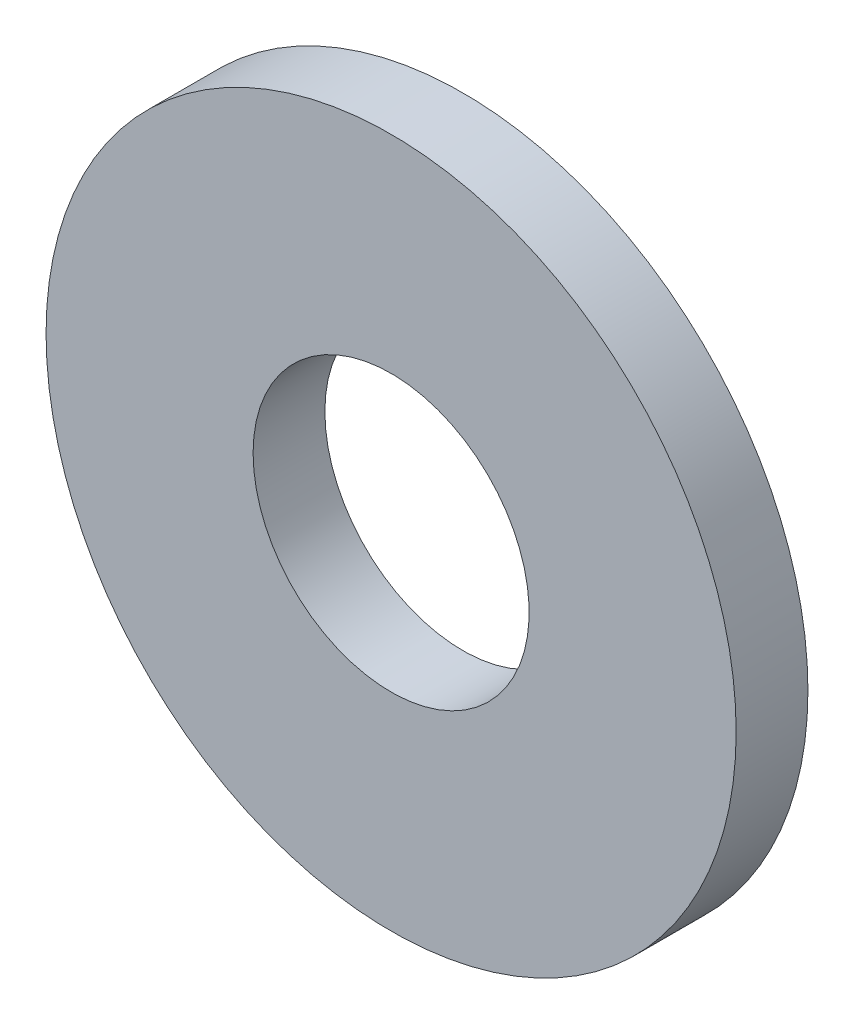
ISO-10303-21;
HEADER;
FILE_DESCRIPTION(('STEP AP214'),'2;1');
FILE_NAME('part.step','',(''),(''),'','','');
FILE_SCHEMA(('AUTOMOTIVE_DESIGN { 1 0 10303 214 1 1 1 1 }'));
ENDSEC;
DATA;
#1=APPLICATION_CONTEXT('core data for automotive mechanical design processes');
#2=APPLICATION_PROTOCOL_DEFINITION('international standard','automotive_design',2000,#1);
#3=PRODUCT_CONTEXT('',#1,'mechanical');
#4=PRODUCT('Part','Part','',(#3));
#5=PRODUCT_RELATED_PRODUCT_CATEGORY('part','',(#4));
#6=PRODUCT_DEFINITION_FORMATION('','',#4);
#7=PRODUCT_DEFINITION_CONTEXT('part definition',#1,'design');
#8=PRODUCT_DEFINITION('design','',#6,#7);
#9=PRODUCT_DEFINITION_SHAPE('','',#8);
#10=(LENGTH_UNIT() NAMED_UNIT(*) SI_UNIT(.MILLI.,.METRE.));
#11=(NAMED_UNIT(*) PLANE_ANGLE_UNIT() SI_UNIT($,.RADIAN.));
#12=(NAMED_UNIT(*) SI_UNIT($,.STERADIAN.) SOLID_ANGLE_UNIT());
#13=UNCERTAINTY_MEASURE_WITH_UNIT(LENGTH_MEASURE(1.E-05),#10,'distance_accuracy_value','');
#14=(GEOMETRIC_REPRESENTATION_CONTEXT(3) GLOBAL_UNCERTAINTY_ASSIGNED_CONTEXT((#13)) GLOBAL_UNIT_ASSIGNED_CONTEXT((#10,
#11,#12)) REPRESENTATION_CONTEXT('',''));
#15=CARTESIAN_POINT('',(0.,0.,0.));
#16=DIRECTION('',(0.,0.,1.));
#17=DIRECTION('',(1.,0.,0.));
#18=AXIS2_PLACEMENT_3D('',#15,#16,#17);
#19=CARTESIAN_POINT('',(0.,0.,1.651));
#20=DIRECTION('',(0.,0.,1.));
#21=DIRECTION('',(1.,0.,0.));
#22=AXIS2_PLACEMENT_3D('',#19,#20,#21);
#23=PLANE('',#22);
#24=CARTESIAN_POINT('',(0.,0.,1.651));
#25=DIRECTION('',(0.,0.,1.));
#26=DIRECTION('',(1.,0.,0.));
#27=AXIS2_PLACEMENT_3D('',#24,#25,#26);
#28=CIRCLE('',#27,7.9375);
#29=CARTESIAN_POINT('',(-7.9375,0.,1.651));
#30=VERTEX_POINT('',#29);
#31=EDGE_CURVE('E10',#30,#30,#28,.T.);
#32=ORIENTED_EDGE('',*,*,#31,.T.);
#33=EDGE_LOOP('',(#32));
#34=FACE_BOUND('',#33,.T.);
#35=CARTESIAN_POINT('',(0.,0.,1.651));
#36=DIRECTION('',(0.,0.,1.));
#37=DIRECTION('',(1.,0.,0.));
#38=AXIS2_PLACEMENT_3D('',#35,#36,#37);
#39=CIRCLE('',#38,3.175);
#40=CARTESIAN_POINT('',(-3.175,0.,1.651));
#41=VERTEX_POINT('',#40);
#42=EDGE_CURVE('E48',#41,#41,#39,.T.);
#43=ORIENTED_EDGE('',*,*,#42,.F.);
#44=EDGE_LOOP('',(#43));
#45=FACE_BOUND('',#44,.T.);
#46=ADVANCED_FACE('F37',(#34,#45),#23,.T.);
#47=CARTESIAN_POINT('',(0.,0.,0.));
#48=DIRECTION('',(0.,0.,1.));
#49=DIRECTION('',(1.,0.,0.));
#50=AXIS2_PLACEMENT_3D('',#47,#48,#49);
#51=PLANE('',#50);
#52=CARTESIAN_POINT('',(0.,0.,0.));
#53=DIRECTION('',(0.,0.,1.));
#54=DIRECTION('',(1.,0.,0.));
#55=AXIS2_PLACEMENT_3D('',#52,#53,#54);
#56=CIRCLE('',#55,7.9375);
#57=CARTESIAN_POINT('',(-7.9375,0.,0.));
#58=VERTEX_POINT('',#57);
#59=EDGE_CURVE('E41',#58,#58,#56,.T.);
#60=ORIENTED_EDGE('',*,*,#59,.F.);
#61=EDGE_LOOP('',(#60));
#62=FACE_BOUND('',#61,.T.);
#63=CARTESIAN_POINT('',(0.,0.,0.));
#64=DIRECTION('',(0.,0.,1.));
#65=DIRECTION('',(1.,0.,0.));
#66=AXIS2_PLACEMENT_3D('',#63,#64,#65);
#67=CIRCLE('',#66,3.175);
#68=CARTESIAN_POINT('',(-3.175,0.,0.));
#69=VERTEX_POINT('',#68);
#70=EDGE_CURVE('E50',#69,#69,#67,.T.);
#71=ORIENTED_EDGE('',*,*,#70,.T.);
#72=EDGE_LOOP('',(#71));
#73=FACE_BOUND('',#72,.T.);
#74=ADVANCED_FACE('F60',(#62,#73),#51,.F.);
#75=CARTESIAN_POINT('',(0.,0.,1.651));
#76=DIRECTION('',(0.,0.,-1.));
#77=DIRECTION('',(-1.,0.,0.));
#78=AXIS2_PLACEMENT_3D('',#75,#76,#77);
#79=CYLINDRICAL_SURFACE('',#78,7.9375);
#80=CARTESIAN_POINT('',(-7.9375,0.,1.651));
#81=CARTESIAN_POINT('',(-7.9375,0.,1.63380208333333));
#82=CARTESIAN_POINT('',(-7.9375,0.,1.61660416666667));
#83=CARTESIAN_POINT('',(-7.9375,0.,1.58220833333333));
#84=CARTESIAN_POINT('',(-7.9375,0.,1.56501041666667));
#85=CARTESIAN_POINT('',(-7.9375,0.,1.53061458333333));
#86=CARTESIAN_POINT('',(-7.9375,0.,1.51341666666667));
#87=CARTESIAN_POINT('',(-7.9375,0.,1.47902083333333));
#88=CARTESIAN_POINT('',(-7.9375,0.,1.46182291666667));
#89=CARTESIAN_POINT('',(-7.9375,0.,1.42742708333333));
#90=CARTESIAN_POINT('',(-7.9375,0.,1.41022916666667));
#91=CARTESIAN_POINT('',(-7.9375,0.,1.37583333333333));
#92=CARTESIAN_POINT('',(-7.9375,0.,1.35863541666667));
#93=CARTESIAN_POINT('',(-7.9375,0.,1.32423958333333));
#94=CARTESIAN_POINT('',(-7.9375,0.,1.30704166666667));
#95=CARTESIAN_POINT('',(-7.9375,0.,1.27264583333333));
#96=CARTESIAN_POINT('',(-7.9375,0.,1.25544791666667));
#97=CARTESIAN_POINT('',(-7.9375,0.,1.22105208333333));
#98=CARTESIAN_POINT('',(-7.9375,0.,1.20385416666667));
#99=CARTESIAN_POINT('',(-7.9375,0.,1.16945833333333));
#100=CARTESIAN_POINT('',(-7.9375,0.,1.15226041666667));
#101=CARTESIAN_POINT('',(-7.9375,0.,1.11786458333333));
#102=CARTESIAN_POINT('',(-7.9375,0.,1.10066666666667));
#103=CARTESIAN_POINT('',(-7.9375,0.,1.06627083333333));
#104=CARTESIAN_POINT('',(-7.9375,0.,1.04907291666667));
#105=CARTESIAN_POINT('',(-7.9375,0.,1.01467708333333));
#106=CARTESIAN_POINT('',(-7.9375,0.,0.997479166666666));
#107=CARTESIAN_POINT('',(-7.9375,0.,0.963083333333333));
#108=CARTESIAN_POINT('',(-7.9375,0.,0.945885416666667));
#109=CARTESIAN_POINT('',(-7.9375,0.,0.911489583333333));
#110=CARTESIAN_POINT('',(-7.9375,0.,0.894291666666667));
#111=CARTESIAN_POINT('',(-7.9375,0.,0.859895833333333));
#112=CARTESIAN_POINT('',(-7.9375,0.,0.842697916666667));
#113=CARTESIAN_POINT('',(-7.9375,0.,0.808302083333333));
#114=CARTESIAN_POINT('',(-7.9375,0.,0.791104166666667));
#115=CARTESIAN_POINT('',(-7.9375,0.,0.756708333333333));
#116=CARTESIAN_POINT('',(-7.9375,0.,0.739510416666667));
#117=CARTESIAN_POINT('',(-7.9375,0.,0.705114583333333));
#118=CARTESIAN_POINT('',(-7.9375,0.,0.687916666666667));
#119=CARTESIAN_POINT('',(-7.9375,0.,0.653520833333333));
#120=CARTESIAN_POINT('',(-7.9375,0.,0.636322916666667));
#121=CARTESIAN_POINT('',(-7.9375,0.,0.601927083333333));
#122=CARTESIAN_POINT('',(-7.9375,0.,0.584729166666667));
#123=CARTESIAN_POINT('',(-7.9375,0.,0.550333333333333));
#124=CARTESIAN_POINT('',(-7.9375,0.,0.533135416666667));
#125=CARTESIAN_POINT('',(-7.9375,0.,0.498739583333333));
#126=CARTESIAN_POINT('',(-7.9375,0.,0.481541666666667));
#127=CARTESIAN_POINT('',(-7.9375,0.,0.447145833333333));
#128=CARTESIAN_POINT('',(-7.9375,0.,0.429947916666667));
#129=CARTESIAN_POINT('',(-7.9375,0.,0.395552083333333));
#130=CARTESIAN_POINT('',(-7.9375,0.,0.378354166666667));
#131=CARTESIAN_POINT('',(-7.9375,0.,0.343958333333333));
#132=CARTESIAN_POINT('',(-7.9375,0.,0.326760416666667));
#133=CARTESIAN_POINT('',(-7.9375,0.,0.292364583333333));
#134=CARTESIAN_POINT('',(-7.9375,0.,0.275166666666667));
#135=CARTESIAN_POINT('',(-7.9375,0.,0.240770833333333));
#136=CARTESIAN_POINT('',(-7.9375,0.,0.223572916666667));
#137=CARTESIAN_POINT('',(-7.9375,0.,0.189177083333333));
#138=CARTESIAN_POINT('',(-7.9375,0.,0.171979166666667));
#139=CARTESIAN_POINT('',(-7.9375,0.,0.137583333333333));
#140=CARTESIAN_POINT('',(-7.9375,0.,0.120385416666667));
#141=CARTESIAN_POINT('',(-7.9375,0.,0.0859895833333333));
#142=CARTESIAN_POINT('',(-7.9375,0.,0.0687916666666667));
#143=CARTESIAN_POINT('',(-7.9375,0.,0.0343958333333333));
#144=CARTESIAN_POINT('',(-7.9375,0.,0.0171979166666666));
#145=CARTESIAN_POINT('',(-7.9375,0.,0.));
#146=B_SPLINE_CURVE_WITH_KNOTS('',3,(#80,#81,#82,#83,#84,#85,#86,#87,#88,#89,#90,#91,#92,#93,
#94,#95,#96,#97,#98,#99,#100,#101,#102,#103,#104,#105,#106,#107,#108,#109,#110,#111,#112,#113,
#114,#115,#116,#117,#118,#119,#120,#121,#122,#123,#124,#125,#126,#127,#128,#129,#130,#131,#132,
#133,#134,#135,#136,#137,#138,#139,#140,#141,#142,#143,#144,#145),.UNSPECIFIED.,.F.,.F.,(4,2,2,
2,2,2,2,2,2,2,2,2,2,2,2,2,2,2,2,2,2,2,2,2,2,2,2,2,2,2,2,2,4),(0.,0.05159375,0.1031875,
0.15478125,0.206375,0.25796875,0.3095625,0.36115625,0.41275,0.46434375,0.5159375,0.56753125,
0.619125,0.67071875,0.7223125,0.77390625,0.8255,0.87709375,0.9286875,0.98028125,1.031875,
1.08346875,1.1350625,1.18665625,1.23825,1.28984375,1.3414375,1.39303125,1.444625,1.49621875,
1.5478125,1.59940625,1.651),.UNSPECIFIED.);
#147=EDGE_CURVE('BSEAM39',#30,#58,#146,.T.);
#148=ORIENTED_EDGE('',*,*,#31,.F.);
#149=ORIENTED_EDGE('',*,*,#59,.T.);
#150=ORIENTED_EDGE('',*,*,#147,.T.);
#151=ORIENTED_EDGE('',*,*,#147,.F.);
#152=EDGE_LOOP('',(#148,#150,#149,#151));
#153=FACE_BOUND('',#152,.T.);
#154=ADVANCED_FACE('F39',(#153),#79,.T.);
#155=CARTESIAN_POINT('',(0.,0.,1.651));
#156=DIRECTION('',(0.,0.,-1.));
#157=DIRECTION('',(-1.,0.,0.));
#158=AXIS2_PLACEMENT_3D('',#155,#156,#157);
#159=CYLINDRICAL_SURFACE('',#158,3.175);
#160=CARTESIAN_POINT('',(-3.175,0.,1.651));
#161=CARTESIAN_POINT('',(-3.175,0.,1.63380208333333));
#162=CARTESIAN_POINT('',(-3.175,0.,1.61660416666667));
#163=CARTESIAN_POINT('',(-3.175,0.,1.58220833333333));
#164=CARTESIAN_POINT('',(-3.175,0.,1.56501041666667));
#165=CARTESIAN_POINT('',(-3.175,0.,1.53061458333333));
#166=CARTESIAN_POINT('',(-3.175,0.,1.51341666666667));
#167=CARTESIAN_POINT('',(-3.175,0.,1.47902083333333));
#168=CARTESIAN_POINT('',(-3.175,0.,1.46182291666667));
#169=CARTESIAN_POINT('',(-3.175,0.,1.42742708333333));
#170=CARTESIAN_POINT('',(-3.175,0.,1.41022916666667));
#171=CARTESIAN_POINT('',(-3.175,0.,1.37583333333333));
#172=CARTESIAN_POINT('',(-3.175,0.,1.35863541666667));
#173=CARTESIAN_POINT('',(-3.175,0.,1.32423958333333));
#174=CARTESIAN_POINT('',(-3.175,0.,1.30704166666667));
#175=CARTESIAN_POINT('',(-3.175,0.,1.27264583333333));
#176=CARTESIAN_POINT('',(-3.175,0.,1.25544791666667));
#177=CARTESIAN_POINT('',(-3.175,0.,1.22105208333333));
#178=CARTESIAN_POINT('',(-3.175,0.,1.20385416666667));
#179=CARTESIAN_POINT('',(-3.175,0.,1.16945833333333));
#180=CARTESIAN_POINT('',(-3.175,0.,1.15226041666667));
#181=CARTESIAN_POINT('',(-3.175,0.,1.11786458333333));
#182=CARTESIAN_POINT('',(-3.175,0.,1.10066666666667));
#183=CARTESIAN_POINT('',(-3.175,0.,1.06627083333333));
#184=CARTESIAN_POINT('',(-3.175,0.,1.04907291666667));
#185=CARTESIAN_POINT('',(-3.175,0.,1.01467708333333));
#186=CARTESIAN_POINT('',(-3.175,0.,0.997479166666666));
#187=CARTESIAN_POINT('',(-3.175,0.,0.963083333333333));
#188=CARTESIAN_POINT('',(-3.175,0.,0.945885416666667));
#189=CARTESIAN_POINT('',(-3.175,0.,0.911489583333333));
#190=CARTESIAN_POINT('',(-3.175,0.,0.894291666666667));
#191=CARTESIAN_POINT('',(-3.175,0.,0.859895833333333));
#192=CARTESIAN_POINT('',(-3.175,0.,0.842697916666667));
#193=CARTESIAN_POINT('',(-3.175,0.,0.808302083333333));
#194=CARTESIAN_POINT('',(-3.175,0.,0.791104166666667));
#195=CARTESIAN_POINT('',(-3.175,0.,0.756708333333333));
#196=CARTESIAN_POINT('',(-3.175,0.,0.739510416666667));
#197=CARTESIAN_POINT('',(-3.175,0.,0.705114583333333));
#198=CARTESIAN_POINT('',(-3.175,0.,0.687916666666667));
#199=CARTESIAN_POINT('',(-3.175,0.,0.653520833333333));
#200=CARTESIAN_POINT('',(-3.175,0.,0.636322916666667));
#201=CARTESIAN_POINT('',(-3.175,0.,0.601927083333333));
#202=CARTESIAN_POINT('',(-3.175,0.,0.584729166666667));
#203=CARTESIAN_POINT('',(-3.175,0.,0.550333333333333));
#204=CARTESIAN_POINT('',(-3.175,0.,0.533135416666667));
#205=CARTESIAN_POINT('',(-3.175,0.,0.498739583333333));
#206=CARTESIAN_POINT('',(-3.175,0.,0.481541666666667));
#207=CARTESIAN_POINT('',(-3.175,0.,0.447145833333333));
#208=CARTESIAN_POINT('',(-3.175,0.,0.429947916666667));
#209=CARTESIAN_POINT('',(-3.175,0.,0.395552083333333));
#210=CARTESIAN_POINT('',(-3.175,0.,0.378354166666667));
#211=CARTESIAN_POINT('',(-3.175,0.,0.343958333333333));
#212=CARTESIAN_POINT('',(-3.175,0.,0.326760416666667));
#213=CARTESIAN_POINT('',(-3.175,0.,0.292364583333333));
#214=CARTESIAN_POINT('',(-3.175,0.,0.275166666666667));
#215=CARTESIAN_POINT('',(-3.175,0.,0.240770833333333));
#216=CARTESIAN_POINT('',(-3.175,0.,0.223572916666667));
#217=CARTESIAN_POINT('',(-3.175,0.,0.189177083333333));
#218=CARTESIAN_POINT('',(-3.175,0.,0.171979166666667));
#219=CARTESIAN_POINT('',(-3.175,0.,0.137583333333333));
#220=CARTESIAN_POINT('',(-3.175,0.,0.120385416666667));
#221=CARTESIAN_POINT('',(-3.175,0.,0.0859895833333333));
#222=CARTESIAN_POINT('',(-3.175,0.,0.0687916666666667));
#223=CARTESIAN_POINT('',(-3.175,0.,0.0343958333333333));
#224=CARTESIAN_POINT('',(-3.175,0.,0.0171979166666666));
#225=CARTESIAN_POINT('',(-3.175,0.,0.));
#226=B_SPLINE_CURVE_WITH_KNOTS('',3,(#160,#161,#162,#163,#164,#165,#166,#167,#168,#169,#170,
#171,#172,#173,#174,#175,#176,#177,#178,#179,#180,#181,#182,#183,#184,#185,#186,#187,#188,#189,
#190,#191,#192,#193,#194,#195,#196,#197,#198,#199,#200,#201,#202,#203,#204,#205,#206,#207,#208,
#209,#210,#211,#212,#213,#214,#215,#216,#217,#218,#219,#220,#221,#222,#223,#224,#225),
.UNSPECIFIED.,.F.,.F.,(4,2,2,2,2,2,2,2,2,2,2,2,2,2,2,2,2,2,2,2,2,2,2,2,2,2,2,2,2,2,2,2,4),(0.,
0.05159375,0.1031875,0.15478125,0.206375,0.25796875,0.3095625,0.36115625,0.41275,0.46434375,
0.5159375,0.56753125,0.619125,0.67071875,0.7223125,0.77390625,0.8255,0.87709375,0.9286875,
0.98028125,1.031875,1.08346875,1.1350625,1.18665625,1.23825,1.28984375,1.3414375,1.39303125,
1.444625,1.49621875,1.5478125,1.59940625,1.651),.UNSPECIFIED.);
#227=EDGE_CURVE('BSEAM56',#41,#69,#226,.T.);
#228=ORIENTED_EDGE('',*,*,#42,.T.);
#229=ORIENTED_EDGE('',*,*,#70,.F.);
#230=ORIENTED_EDGE('',*,*,#227,.T.);
#231=ORIENTED_EDGE('',*,*,#227,.F.);
#232=EDGE_LOOP('',(#228,#230,#229,#231));
#233=FACE_BOUND('',#232,.T.);
#234=ADVANCED_FACE('F56',(#233),#159,.F.);
#235=CLOSED_SHELL('',(#46,#74,#154,#234));
#236=MANIFOLD_SOLID_BREP('B2',#235);
#237=ADVANCED_BREP_SHAPE_REPRESENTATION('',(#18,#236),#14);
#238=SHAPE_DEFINITION_REPRESENTATION(#9,#237);
ENDSEC;
END-ISO-10303-21;
